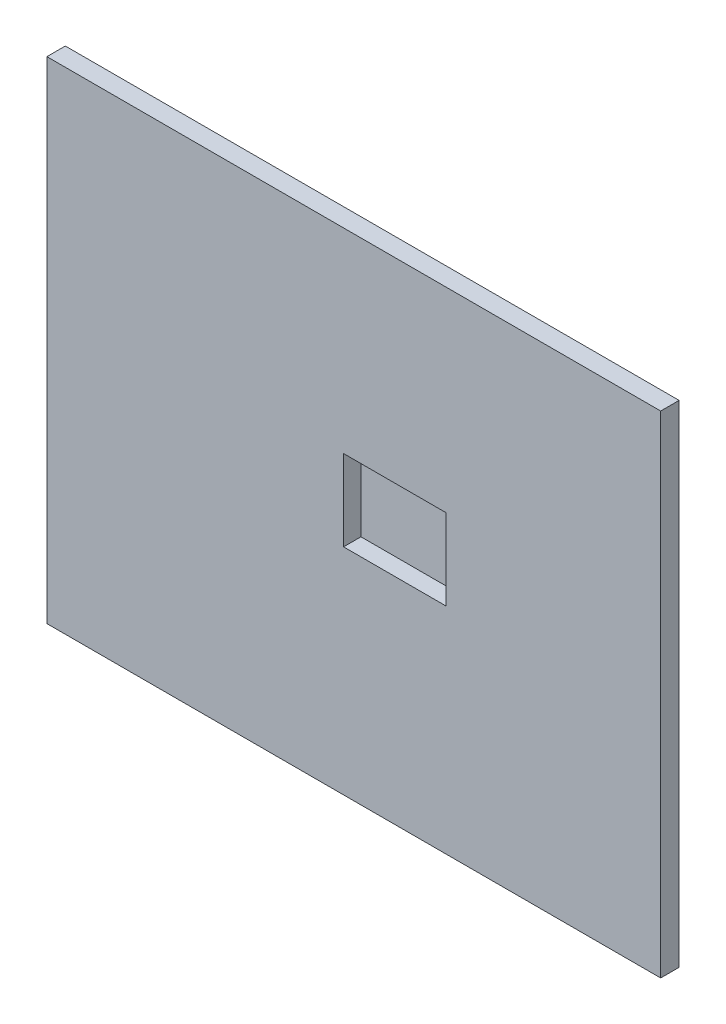
ISO-10303-21;
HEADER;
FILE_DESCRIPTION(('STEP AP214'),'2;1');
FILE_NAME('part.step','',(''),(''),'','','');
FILE_SCHEMA(('AUTOMOTIVE_DESIGN { 1 0 10303 214 1 1 1 1 }'));
ENDSEC;
DATA;
#1=APPLICATION_CONTEXT('core data for automotive mechanical design processes');
#2=APPLICATION_PROTOCOL_DEFINITION('international standard','automotive_design',2000,#1);
#3=PRODUCT_CONTEXT('',#1,'mechanical');
#4=PRODUCT('Part','Part','',(#3));
#5=PRODUCT_RELATED_PRODUCT_CATEGORY('part','',(#4));
#6=PRODUCT_DEFINITION_FORMATION('','',#4);
#7=PRODUCT_DEFINITION_CONTEXT('part definition',#1,'design');
#8=PRODUCT_DEFINITION('design','',#6,#7);
#9=PRODUCT_DEFINITION_SHAPE('','',#8);
#10=(LENGTH_UNIT() NAMED_UNIT(*) SI_UNIT(.MILLI.,.METRE.));
#11=(NAMED_UNIT(*) PLANE_ANGLE_UNIT() SI_UNIT($,.RADIAN.));
#12=(NAMED_UNIT(*) SI_UNIT($,.STERADIAN.) SOLID_ANGLE_UNIT());
#13=UNCERTAINTY_MEASURE_WITH_UNIT(LENGTH_MEASURE(1.E-05),#10,'distance_accuracy_value','');
#14=(GEOMETRIC_REPRESENTATION_CONTEXT(3) GLOBAL_UNCERTAINTY_ASSIGNED_CONTEXT((#13)) GLOBAL_UNIT_ASSIGNED_CONTEXT((#10,
#11,#12)) REPRESENTATION_CONTEXT('',''));
#15=CARTESIAN_POINT('',(0.,0.,0.));
#16=DIRECTION('',(0.,0.,1.));
#17=DIRECTION('',(1.,0.,0.));
#18=AXIS2_PLACEMENT_3D('',#15,#16,#17);
#19=CARTESIAN_POINT('',(300.,240.,18.));
#20=DIRECTION('',(-1.,0.,0.));
#21=DIRECTION('',(0.,-1.,0.));
#22=AXIS2_PLACEMENT_3D('',#19,#20,#21);
#23=PLANE('',#22);
#24=DIRECTION('',(0.,1.,0.));
#25=VECTOR('',#24,1.);
#26=CARTESIAN_POINT('',(300.,240.,0.));
#27=LINE('',#26,#25);
#28=CARTESIAN_POINT('',(300.,-240.,0.));
#29=VERTEX_POINT('',#28);
#30=CARTESIAN_POINT('',(300.,240.,0.));
#31=VERTEX_POINT('',#30);
#32=EDGE_CURVE('E145',#29,#31,#27,.T.);
#33=ORIENTED_EDGE('',*,*,#32,.T.);
#34=DIRECTION('',(0.,0.,-1.));
#35=VECTOR('',#34,1.);
#36=CARTESIAN_POINT('',(300.,240.,18.));
#37=LINE('',#36,#35);
#38=CARTESIAN_POINT('',(300.,240.,18.));
#39=VERTEX_POINT('',#38);
#40=EDGE_CURVE('E11',#39,#31,#37,.T.);
#41=ORIENTED_EDGE('',*,*,#40,.F.);
#42=DIRECTION('',(0.,1.,0.));
#43=VECTOR('',#42,1.);
#44=CARTESIAN_POINT('',(300.,240.,18.));
#45=LINE('',#44,#43);
#46=CARTESIAN_POINT('',(300.,-240.,18.));
#47=VERTEX_POINT('',#46);
#48=EDGE_CURVE('E149',#47,#39,#45,.T.);
#49=ORIENTED_EDGE('',*,*,#48,.F.);
#50=DIRECTION('',(0.,0.,-1.));
#51=VECTOR('',#50,1.);
#52=CARTESIAN_POINT('',(300.,-240.,18.));
#53=LINE('',#52,#51);
#54=EDGE_CURVE('E155',#47,#29,#53,.T.);
#55=ORIENTED_EDGE('',*,*,#54,.T.);
#56=EDGE_LOOP('',(#33,#41,#49,#55));
#57=FACE_BOUND('',#56,.T.);
#58=ADVANCED_FACE('F37',(#57),#23,.F.);
#59=CARTESIAN_POINT('',(-300.,240.,18.));
#60=DIRECTION('',(0.,-1.,0.));
#61=DIRECTION('',(0.,0.,-1.));
#62=AXIS2_PLACEMENT_3D('',#59,#60,#61);
#63=PLANE('',#62);
#64=DIRECTION('',(-1.,0.,0.));
#65=VECTOR('',#64,1.);
#66=CARTESIAN_POINT('',(-300.,240.,0.));
#67=LINE('',#66,#65);
#68=CARTESIAN_POINT('',(-300.,240.,0.));
#69=VERTEX_POINT('',#68);
#70=EDGE_CURVE('E158',#31,#69,#67,.T.);
#71=ORIENTED_EDGE('',*,*,#70,.T.);
#72=DIRECTION('',(0.,0.,-1.));
#73=VECTOR('',#72,1.);
#74=CARTESIAN_POINT('',(-300.,240.,18.));
#75=LINE('',#74,#73);
#76=CARTESIAN_POINT('',(-300.,240.,18.));
#77=VERTEX_POINT('',#76);
#78=EDGE_CURVE('E44',#77,#69,#75,.T.);
#79=ORIENTED_EDGE('',*,*,#78,.F.);
#80=DIRECTION('',(-1.,0.,0.));
#81=VECTOR('',#80,1.);
#82=CARTESIAN_POINT('',(-300.,240.,18.));
#83=LINE('',#82,#81);
#84=EDGE_CURVE('E88',#39,#77,#83,.T.);
#85=ORIENTED_EDGE('',*,*,#84,.F.);
#86=ORIENTED_EDGE('',*,*,#40,.T.);
#87=EDGE_LOOP('',(#71,#79,#85,#86));
#88=FACE_BOUND('',#87,.T.);
#89=ADVANCED_FACE('F188',(#88),#63,.F.);
#90=CARTESIAN_POINT('',(-300.,240.,18.));
#91=DIRECTION('',(1.,0.,0.));
#92=DIRECTION('',(0.,1.,0.));
#93=AXIS2_PLACEMENT_3D('',#90,#91,#92);
#94=PLANE('',#93);
#95=DIRECTION('',(0.,-1.,0.));
#96=VECTOR('',#95,1.);
#97=CARTESIAN_POINT('',(-300.,240.,0.));
#98=LINE('',#97,#96);
#99=CARTESIAN_POINT('',(-300.,-240.,0.));
#100=VERTEX_POINT('',#99);
#101=EDGE_CURVE('E160',#69,#100,#98,.T.);
#102=ORIENTED_EDGE('',*,*,#101,.T.);
#103=DIRECTION('',(0.,0.,-1.));
#104=VECTOR('',#103,1.);
#105=CARTESIAN_POINT('',(-300.,-240.,18.));
#106=LINE('',#105,#104);
#107=CARTESIAN_POINT('',(-300.,-240.,18.));
#108=VERTEX_POINT('',#107);
#109=EDGE_CURVE('E164',#108,#100,#106,.T.);
#110=ORIENTED_EDGE('',*,*,#109,.F.);
#111=DIRECTION('',(0.,-1.,0.));
#112=VECTOR('',#111,1.);
#113=CARTESIAN_POINT('',(-300.,240.,18.));
#114=LINE('',#113,#112);
#115=EDGE_CURVE('E152',#77,#108,#114,.T.);
#116=ORIENTED_EDGE('',*,*,#115,.F.);
#117=ORIENTED_EDGE('',*,*,#78,.T.);
#118=EDGE_LOOP('',(#102,#110,#116,#117));
#119=FACE_BOUND('',#118,.T.);
#120=ADVANCED_FACE('F169',(#119),#94,.F.);
#121=CARTESIAN_POINT('',(-300.,-240.,18.));
#122=DIRECTION('',(0.,1.,0.));
#123=DIRECTION('',(0.,0.,1.));
#124=AXIS2_PLACEMENT_3D('',#121,#122,#123);
#125=PLANE('',#124);
#126=DIRECTION('',(1.,0.,0.));
#127=VECTOR('',#126,1.);
#128=CARTESIAN_POINT('',(-300.,-240.,0.));
#129=LINE('',#128,#127);
#130=EDGE_CURVE('E81',#100,#29,#129,.T.);
#131=ORIENTED_EDGE('',*,*,#130,.T.);
#132=ORIENTED_EDGE('',*,*,#54,.F.);
#133=DIRECTION('',(1.,0.,0.));
#134=VECTOR('',#133,1.);
#135=CARTESIAN_POINT('',(-300.,-240.,18.));
#136=LINE('',#135,#134);
#137=EDGE_CURVE('E60',#108,#47,#136,.T.);
#138=ORIENTED_EDGE('',*,*,#137,.F.);
#139=ORIENTED_EDGE('',*,*,#109,.T.);
#140=EDGE_LOOP('',(#131,#132,#138,#139));
#141=FACE_BOUND('',#140,.T.);
#142=ADVANCED_FACE('F177',(#141),#125,.F.);
#143=CARTESIAN_POINT('',(0.,0.,18.));
#144=DIRECTION('',(0.,0.,1.));
#145=DIRECTION('',(1.,0.,0.));
#146=AXIS2_PLACEMENT_3D('',#143,#144,#145);
#147=PLANE('',#146);
#148=DIRECTION('',(0.,-1.,0.));
#149=VECTOR('',#148,1.);
#150=CARTESIAN_POINT('',(-9.99999999999995,-30.0000000000001,18.));
#151=LINE('',#150,#149);
#152=CARTESIAN_POINT('',(-9.99999999999995,48.9999999999999,18.));
#153=VERTEX_POINT('',#152);
#154=CARTESIAN_POINT('',(-9.99999999999995,-30.0000000000001,18.));
#155=VERTEX_POINT('',#154);
#156=EDGE_CURVE('E51',#153,#155,#151,.T.);
#157=ORIENTED_EDGE('',*,*,#156,.F.);
#158=DIRECTION('',(-1.,0.,0.));
#159=VECTOR('',#158,1.);
#160=CARTESIAN_POINT('',(-9.99999999999995,48.9999999999999,18.));
#161=LINE('',#160,#159);
#162=CARTESIAN_POINT('',(90.0000000000001,48.9999999999999,18.));
#163=VERTEX_POINT('',#162);
#164=EDGE_CURVE('E130',#163,#153,#161,.T.);
#165=ORIENTED_EDGE('',*,*,#164,.F.);
#166=DIRECTION('',(0.,1.,0.));
#167=VECTOR('',#166,1.);
#168=CARTESIAN_POINT('',(90.0000000000001,-30.0000000000001,18.));
#169=LINE('',#168,#167);
#170=CARTESIAN_POINT('',(90.0000000000001,-30.0000000000001,18.));
#171=VERTEX_POINT('',#170);
#172=EDGE_CURVE('E133',#171,#163,#169,.T.);
#173=ORIENTED_EDGE('',*,*,#172,.F.);
#174=DIRECTION('',(1.,0.,0.));
#175=VECTOR('',#174,1.);
#176=CARTESIAN_POINT('',(-9.99999999999995,-30.0000000000001,18.));
#177=LINE('',#176,#175);
#178=EDGE_CURVE('E139',#155,#171,#177,.T.);
#179=ORIENTED_EDGE('',*,*,#178,.F.);
#180=EDGE_LOOP('',(#157,#165,#173,#179));
#181=FACE_BOUND('',#180,.T.);
#182=ORIENTED_EDGE('',*,*,#48,.T.);
#183=ORIENTED_EDGE('',*,*,#84,.T.);
#184=ORIENTED_EDGE('',*,*,#115,.T.);
#185=ORIENTED_EDGE('',*,*,#137,.T.);
#186=EDGE_LOOP('',(#182,#183,#184,#185));
#187=FACE_BOUND('',#186,.T.);
#188=ADVANCED_FACE('F179',(#181,#187),#147,.T.);
#189=CARTESIAN_POINT('',(0.,0.,0.));
#190=DIRECTION('',(0.,0.,1.));
#191=DIRECTION('',(1.,0.,0.));
#192=AXIS2_PLACEMENT_3D('',#189,#190,#191);
#193=PLANE('',#192);
#194=ORIENTED_EDGE('',*,*,#32,.F.);
#195=ORIENTED_EDGE('',*,*,#130,.F.);
#196=ORIENTED_EDGE('',*,*,#101,.F.);
#197=ORIENTED_EDGE('',*,*,#70,.F.);
#198=EDGE_LOOP('',(#194,#195,#196,#197));
#199=FACE_BOUND('',#198,.T.);
#200=ADVANCED_FACE('F173',(#199),#193,.F.);
#201=CARTESIAN_POINT('',(-9.99999999999995,-30.0000000000001,1.));
#202=DIRECTION('',(-1.,0.,0.));
#203=DIRECTION('',(0.,0.,1.));
#204=AXIS2_PLACEMENT_3D('',#201,#202,#203);
#205=PLANE('',#204);
#206=ORIENTED_EDGE('',*,*,#156,.T.);
#207=DIRECTION('',(0.,0.,1.));
#208=VECTOR('',#207,1.);
#209=CARTESIAN_POINT('',(-9.99999999999995,-30.0000000000001,1.));
#210=LINE('',#209,#208);
#211=CARTESIAN_POINT('',(-9.99999999999995,-30.0000000000001,1.));
#212=VERTEX_POINT('',#211);
#213=EDGE_CURVE('E108',#212,#155,#210,.T.);
#214=ORIENTED_EDGE('',*,*,#213,.F.);
#215=DIRECTION('',(0.,-1.,0.));
#216=VECTOR('',#215,1.);
#217=CARTESIAN_POINT('',(-9.99999999999995,-30.0000000000001,1.));
#218=LINE('',#217,#216);
#219=CARTESIAN_POINT('',(-9.99999999999995,48.9999999999999,1.));
#220=VERTEX_POINT('',#219);
#221=EDGE_CURVE('E112',#220,#212,#218,.T.);
#222=ORIENTED_EDGE('',*,*,#221,.F.);
#223=DIRECTION('',(0.,0.,1.));
#224=VECTOR('',#223,1.);
#225=CARTESIAN_POINT('',(-9.99999999999995,48.9999999999999,1.));
#226=LINE('',#225,#224);
#227=EDGE_CURVE('E143',#220,#153,#226,.T.);
#228=ORIENTED_EDGE('',*,*,#227,.T.);
#229=EDGE_LOOP('',(#206,#214,#222,#228));
#230=FACE_BOUND('',#229,.T.);
#231=ADVANCED_FACE('F110',(#230),#205,.F.);
#232=CARTESIAN_POINT('',(-9.99999999999995,48.9999999999999,1.));
#233=DIRECTION('',(0.,1.,0.));
#234=DIRECTION('',(0.,0.,1.));
#235=AXIS2_PLACEMENT_3D('',#232,#233,#234);
#236=PLANE('',#235);
#237=ORIENTED_EDGE('',*,*,#164,.T.);
#238=ORIENTED_EDGE('',*,*,#227,.F.);
#239=DIRECTION('',(-1.,0.,0.));
#240=VECTOR('',#239,1.);
#241=CARTESIAN_POINT('',(-9.99999999999995,48.9999999999999,1.));
#242=LINE('',#241,#240);
#243=CARTESIAN_POINT('',(90.0000000000001,48.9999999999999,1.));
#244=VERTEX_POINT('',#243);
#245=EDGE_CURVE('E118',#244,#220,#242,.T.);
#246=ORIENTED_EDGE('',*,*,#245,.F.);
#247=DIRECTION('',(0.,0.,1.));
#248=VECTOR('',#247,1.);
#249=CARTESIAN_POINT('',(90.0000000000001,48.9999999999999,1.));
#250=LINE('',#249,#248);
#251=EDGE_CURVE('E146',#244,#163,#250,.T.);
#252=ORIENTED_EDGE('',*,*,#251,.T.);
#253=EDGE_LOOP('',(#237,#238,#246,#252));
#254=FACE_BOUND('',#253,.T.);
#255=ADVANCED_FACE('F227',(#254),#236,.F.);
#256=CARTESIAN_POINT('',(90.0000000000001,-30.0000000000001,1.));
#257=DIRECTION('',(1.,0.,0.));
#258=DIRECTION('',(0.,0.,-1.));
#259=AXIS2_PLACEMENT_3D('',#256,#257,#258);
#260=PLANE('',#259);
#261=ORIENTED_EDGE('',*,*,#172,.T.);
#262=ORIENTED_EDGE('',*,*,#251,.F.);
#263=DIRECTION('',(0.,1.,0.));
#264=VECTOR('',#263,1.);
#265=CARTESIAN_POINT('',(90.0000000000001,-30.0000000000001,1.));
#266=LINE('',#265,#264);
#267=CARTESIAN_POINT('',(90.0000000000001,-30.0000000000001,1.));
#268=VERTEX_POINT('',#267);
#269=EDGE_CURVE('E126',#268,#244,#266,.T.);
#270=ORIENTED_EDGE('',*,*,#269,.F.);
#271=DIRECTION('',(0.,0.,1.));
#272=VECTOR('',#271,1.);
#273=CARTESIAN_POINT('',(90.0000000000001,-30.0000000000001,1.));
#274=LINE('',#273,#272);
#275=EDGE_CURVE('E117',#268,#171,#274,.T.);
#276=ORIENTED_EDGE('',*,*,#275,.T.);
#277=EDGE_LOOP('',(#261,#262,#270,#276));
#278=FACE_BOUND('',#277,.T.);
#279=ADVANCED_FACE('F237',(#278),#260,.F.);
#280=CARTESIAN_POINT('',(-9.99999999999995,-30.0000000000001,1.));
#281=DIRECTION('',(0.,-1.,0.));
#282=DIRECTION('',(0.,0.,-1.));
#283=AXIS2_PLACEMENT_3D('',#280,#281,#282);
#284=PLANE('',#283);
#285=ORIENTED_EDGE('',*,*,#178,.T.);
#286=ORIENTED_EDGE('',*,*,#275,.F.);
#287=DIRECTION('',(1.,0.,0.));
#288=VECTOR('',#287,1.);
#289=CARTESIAN_POINT('',(-9.99999999999995,-30.0000000000001,1.));
#290=LINE('',#289,#288);
#291=EDGE_CURVE('E121',#212,#268,#290,.T.);
#292=ORIENTED_EDGE('',*,*,#291,.F.);
#293=ORIENTED_EDGE('',*,*,#213,.T.);
#294=EDGE_LOOP('',(#285,#286,#292,#293));
#295=FACE_BOUND('',#294,.T.);
#296=ADVANCED_FACE('F122',(#295),#284,.F.);
#297=CARTESIAN_POINT('',(0.,0.,1.));
#298=DIRECTION('',(0.,0.,-1.));
#299=DIRECTION('',(-1.,0.,0.));
#300=AXIS2_PLACEMENT_3D('',#297,#298,#299);
#301=PLANE('',#300);
#302=ORIENTED_EDGE('',*,*,#221,.T.);
#303=ORIENTED_EDGE('',*,*,#291,.T.);
#304=ORIENTED_EDGE('',*,*,#269,.T.);
#305=ORIENTED_EDGE('',*,*,#245,.T.);
#306=EDGE_LOOP('',(#302,#303,#304,#305));
#307=FACE_BOUND('',#306,.T.);
#308=ADVANCED_FACE('F128',(#307),#301,.F.);
#309=CLOSED_SHELL('',(#58,#89,#120,#142,#188,#200,#231,#255,#279,#296,#308));
#310=MANIFOLD_SOLID_BREP('B2',#309);
#311=ADVANCED_BREP_SHAPE_REPRESENTATION('',(#18,#310),#14);
#312=SHAPE_DEFINITION_REPRESENTATION(#9,#311);
ENDSEC;
END-ISO-10303-21;
